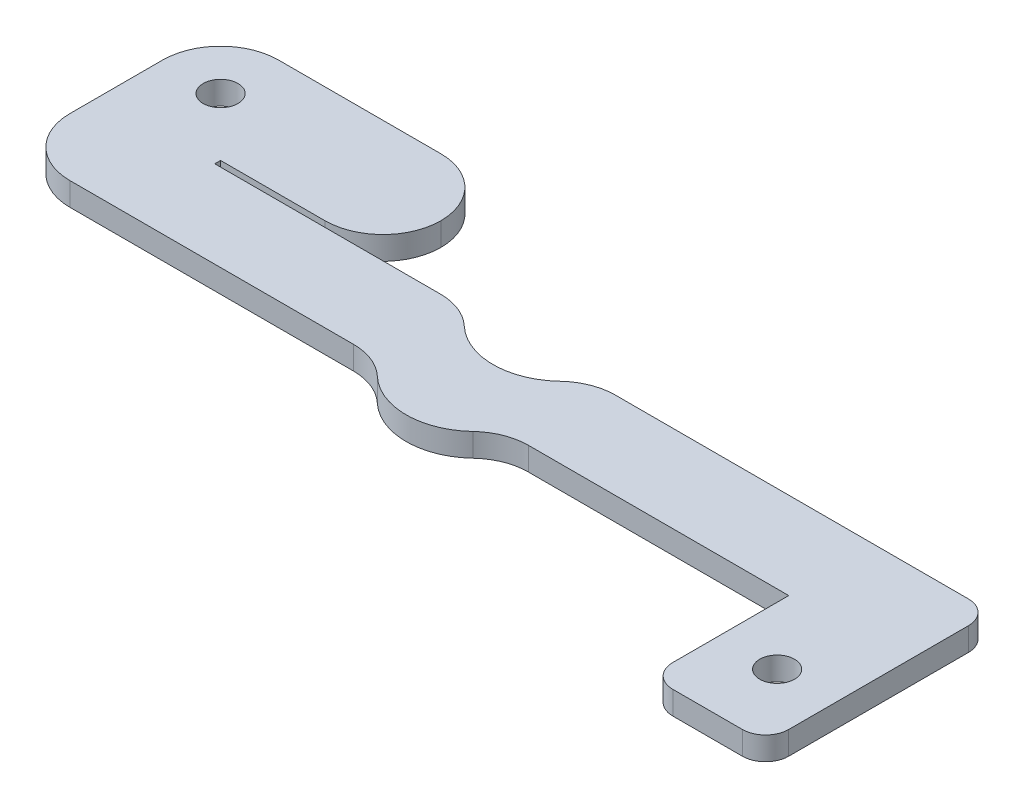
ISO-10303-21;
HEADER;
FILE_DESCRIPTION(('STEP AP214'),'2;1');
FILE_NAME('part.step','',(''),(''),'','','');
FILE_SCHEMA(('AUTOMOTIVE_DESIGN { 1 0 10303 214 1 1 1 1 }'));
ENDSEC;
DATA;
#1=APPLICATION_CONTEXT('core data for automotive mechanical design processes');
#2=APPLICATION_PROTOCOL_DEFINITION('international standard','automotive_design',2000,#1);
#3=PRODUCT_CONTEXT('',#1,'mechanical');
#4=PRODUCT('Part','Part','',(#3));
#5=PRODUCT_RELATED_PRODUCT_CATEGORY('part','',(#4));
#6=PRODUCT_DEFINITION_FORMATION('','',#4);
#7=PRODUCT_DEFINITION_CONTEXT('part definition',#1,'design');
#8=PRODUCT_DEFINITION('design','',#6,#7);
#9=PRODUCT_DEFINITION_SHAPE('','',#8);
#10=(LENGTH_UNIT() NAMED_UNIT(*) SI_UNIT(.MILLI.,.METRE.));
#11=(NAMED_UNIT(*) PLANE_ANGLE_UNIT() SI_UNIT($,.RADIAN.));
#12=(NAMED_UNIT(*) SI_UNIT($,.STERADIAN.) SOLID_ANGLE_UNIT());
#13=UNCERTAINTY_MEASURE_WITH_UNIT(LENGTH_MEASURE(1.E-05),#10,'distance_accuracy_value','');
#14=(GEOMETRIC_REPRESENTATION_CONTEXT(3) GLOBAL_UNCERTAINTY_ASSIGNED_CONTEXT((#13)) GLOBAL_UNIT_ASSIGNED_CONTEXT((#10,
#11,#12)) REPRESENTATION_CONTEXT('',''));
#15=CARTESIAN_POINT('',(0.,0.,0.));
#16=DIRECTION('',(0.,0.,1.));
#17=DIRECTION('',(1.,0.,0.));
#18=AXIS2_PLACEMENT_3D('',#15,#16,#17);
#19=CARTESIAN_POINT('',(-15.,2.,-5.));
#20=DIRECTION('',(-1.,0.,0.));
#21=DIRECTION('',(0.,0.,1.));
#22=AXIS2_PLACEMENT_3D('',#19,#20,#21);
#23=PLANE('',#22);
#24=DIRECTION('',(0.,-1.,0.));
#25=VECTOR('',#24,1.);
#26=CARTESIAN_POINT('',(-15.,0.,5.));
#27=LINE('',#26,#25);
#28=CARTESIAN_POINT('',(-15.,2.,5.));
#29=VERTEX_POINT('',#28);
#30=CARTESIAN_POINT('',(-15.,0.,5.));
#31=VERTEX_POINT('',#30);
#32=EDGE_CURVE('E210',#29,#31,#27,.T.);
#33=ORIENTED_EDGE('',*,*,#32,.F.);
#34=DIRECTION('',(0.,0.,-1.));
#35=VECTOR('',#34,1.);
#36=CARTESIAN_POINT('',(-15.,2.,-5.));
#37=LINE('',#36,#35);
#38=CARTESIAN_POINT('',(-15.,2.,5.5));
#39=VERTEX_POINT('',#38);
#40=EDGE_CURVE('E222',#39,#29,#37,.T.);
#41=ORIENTED_EDGE('',*,*,#40,.F.);
#42=DIRECTION('',(0.,-1.,0.));
#43=VECTOR('',#42,1.);
#44=CARTESIAN_POINT('',(-15.,2.,5.5));
#45=LINE('',#44,#43);
#46=CARTESIAN_POINT('',(-15.,0.,5.5));
#47=VERTEX_POINT('',#46);
#48=EDGE_CURVE('E258',#39,#47,#45,.T.);
#49=ORIENTED_EDGE('',*,*,#48,.T.);
#50=DIRECTION('',(0.,0.,-1.));
#51=VECTOR('',#50,1.);
#52=CARTESIAN_POINT('',(-15.,0.,-5.));
#53=LINE('',#52,#51);
#54=EDGE_CURVE('E224',#47,#31,#53,.T.);
#55=ORIENTED_EDGE('',*,*,#54,.T.);
#56=EDGE_LOOP('',(#33,#41,#49,#55));
#57=FACE_BOUND('',#56,.T.);
#58=ADVANCED_FACE('F47',(#57),#23,.F.);
#59=CARTESIAN_POINT('',(17.1961524227066,2.,13.));
#60=DIRECTION('',(0.,0.,-1.));
#61=DIRECTION('',(-1.,0.,0.));
#62=AXIS2_PLACEMENT_3D('',#59,#60,#61);
#63=PLANE('',#62);
#64=DIRECTION('',(0.,-1.,0.));
#65=VECTOR('',#64,1.);
#66=CARTESIAN_POINT('',(42.,0.,13.));
#67=LINE('',#66,#65);
#68=CARTESIAN_POINT('',(42.,2.,13.));
#69=VERTEX_POINT('',#68);
#70=CARTESIAN_POINT('',(42.,0.,13.));
#71=VERTEX_POINT('',#70);
#72=EDGE_CURVE('E340',#69,#71,#67,.T.);
#73=ORIENTED_EDGE('',*,*,#72,.F.);
#74=DIRECTION('',(1.,0.,0.));
#75=VECTOR('',#74,1.);
#76=CARTESIAN_POINT('',(17.1961524227066,2.,13.));
#77=LINE('',#76,#75);
#78=CARTESIAN_POINT('',(19.5498344352708,2.,13.));
#79=VERTEX_POINT('',#78);
#80=EDGE_CURVE('E250',#79,#69,#77,.T.);
#81=ORIENTED_EDGE('',*,*,#80,.F.);
#82=DIRECTION('',(0.,1.,0.));
#83=VECTOR('',#82,1.);
#84=CARTESIAN_POINT('',(19.5498344352708,0.,13.));
#85=LINE('',#84,#83);
#86=CARTESIAN_POINT('',(19.5498344352708,0.,13.));
#87=VERTEX_POINT('',#86);
#88=EDGE_CURVE('E318',#79,#87,#85,.F.);
#89=ORIENTED_EDGE('',*,*,#88,.T.);
#90=DIRECTION('',(1.,0.,0.));
#91=VECTOR('',#90,1.);
#92=CARTESIAN_POINT('',(17.1961524227066,0.,13.));
#93=LINE('',#92,#91);
#94=EDGE_CURVE('E272',#87,#71,#93,.T.);
#95=ORIENTED_EDGE('',*,*,#94,.T.);
#96=EDGE_LOOP('',(#73,#81,#89,#95));
#97=FACE_BOUND('',#96,.T.);
#98=ADVANCED_FACE('F421',(#97),#63,.F.);
#99=CARTESIAN_POINT('',(-15.,2.,5.5));
#100=DIRECTION('',(0.,0.,1.));
#101=DIRECTION('',(1.,0.,0.));
#102=AXIS2_PLACEMENT_3D('',#99,#100,#101);
#103=PLANE('',#102);
#104=DIRECTION('',(-1.,0.,0.));
#105=VECTOR('',#104,1.);
#106=CARTESIAN_POINT('',(-15.,2.,5.5));
#107=LINE('',#106,#105);
#108=CARTESIAN_POINT('',(50.,2.,5.5));
#109=VERTEX_POINT('',#108);
#110=CARTESIAN_POINT('',(19.5498344352708,2.,5.5));
#111=VERTEX_POINT('',#110);
#112=EDGE_CURVE('E256',#109,#111,#107,.T.);
#113=ORIENTED_EDGE('',*,*,#112,.F.);
#114=DIRECTION('',(0.,-1.,0.));
#115=VECTOR('',#114,1.);
#116=CARTESIAN_POINT('',(50.,2.,5.5));
#117=LINE('',#116,#115);
#118=CARTESIAN_POINT('',(50.,0.,5.5));
#119=VERTEX_POINT('',#118);
#120=EDGE_CURVE('E336',#109,#119,#117,.T.);
#121=ORIENTED_EDGE('',*,*,#120,.T.);
#122=DIRECTION('',(-1.,0.,0.));
#123=VECTOR('',#122,1.);
#124=CARTESIAN_POINT('',(-15.,0.,5.5));
#125=LINE('',#124,#123);
#126=CARTESIAN_POINT('',(19.5498344352708,0.,5.5));
#127=VERTEX_POINT('',#126);
#128=EDGE_CURVE('E232',#119,#127,#125,.T.);
#129=ORIENTED_EDGE('',*,*,#128,.T.);
#130=DIRECTION('',(0.,1.,0.));
#131=VECTOR('',#130,1.);
#132=CARTESIAN_POINT('',(19.5498344352708,2.,5.5));
#133=LINE('',#132,#131);
#134=EDGE_CURVE('E315',#127,#111,#133,.T.);
#135=ORIENTED_EDGE('',*,*,#134,.T.);
#136=EDGE_LOOP('',(#113,#121,#129,#135));
#137=FACE_BOUND('',#136,.T.);
#138=ADVANCED_FACE('F460',(#137),#103,.F.);
#139=CARTESIAN_POINT('',(12.,2.,10.));
#140=DIRECTION('',(0.,1.,0.));
#141=DIRECTION('',(0.,0.,1.));
#142=AXIS2_PLACEMENT_3D('',#139,#140,#141);
#143=PLANE('',#142);
#144=CARTESIAN_POINT('',(47.,2.,19.));
#145=DIRECTION('',(0.,1.,0.));
#146=DIRECTION('',(0.,0.,1.));
#147=AXIS2_PLACEMENT_3D('',#144,#145,#146);
#148=CIRCLE('',#147,1.5);
#149=CARTESIAN_POINT('',(47.,2.,20.5));
#150=VERTEX_POINT('',#149);
#151=EDGE_CURVE('E216',#150,#150,#148,.T.);
#152=ORIENTED_EDGE('',*,*,#151,.F.);
#153=EDGE_LOOP('',(#152));
#154=FACE_BOUND('',#153,.T.);
#155=CARTESIAN_POINT('',(-5.99999999999998,2.,0.));
#156=DIRECTION('',(0.,1.,0.));
#157=DIRECTION('',(0.,0.,1.));
#158=AXIS2_PLACEMENT_3D('',#155,#156,#157);
#159=CIRCLE('',#158,5.);
#160=CARTESIAN_POINT('',(-5.99999999999998,2.,5.));
#161=VERTEX_POINT('',#160);
#162=CARTESIAN_POINT('',(-0.999999999999982,2.,0.));
#163=VERTEX_POINT('',#162);
#164=EDGE_CURVE('E373',#161,#163,#159,.T.);
#165=ORIENTED_EDGE('',*,*,#164,.T.);
#166=CARTESIAN_POINT('',(-5.99999999999998,2.,0.));
#167=DIRECTION('',(0.,1.,0.));
#168=DIRECTION('',(0.,0.,1.));
#169=AXIS2_PLACEMENT_3D('',#166,#167,#168);
#170=CIRCLE('',#169,5.);
#171=CARTESIAN_POINT('',(-5.99999999999998,2.,-5.));
#172=VERTEX_POINT('',#171);
#173=EDGE_CURVE('E69',#163,#172,#170,.T.);
#174=ORIENTED_EDGE('',*,*,#173,.T.);
#175=DIRECTION('',(-1.,0.,0.));
#176=VECTOR('',#175,1.);
#177=CARTESIAN_POINT('',(-15.,2.,-5.));
#178=LINE('',#177,#176);
#179=CARTESIAN_POINT('',(-20.,2.,-5.));
#180=VERTEX_POINT('',#179);
#181=EDGE_CURVE('E231',#172,#180,#178,.T.);
#182=ORIENTED_EDGE('',*,*,#181,.T.);
#183=CARTESIAN_POINT('',(-20.,2.,0.));
#184=DIRECTION('',(0.,1.,0.));
#185=DIRECTION('',(0.,0.,1.));
#186=AXIS2_PLACEMENT_3D('',#183,#184,#185);
#187=CIRCLE('',#186,5.);
#188=CARTESIAN_POINT('',(-25.,2.,0.));
#189=VERTEX_POINT('',#188);
#190=EDGE_CURVE('E288',#180,#189,#187,.T.);
#191=ORIENTED_EDGE('',*,*,#190,.T.);
#192=DIRECTION('',(0.,0.,1.));
#193=VECTOR('',#192,1.);
#194=CARTESIAN_POINT('',(-25.,2.,-5.));
#195=LINE('',#194,#193);
#196=CARTESIAN_POINT('',(-25.,2.,8.));
#197=VERTEX_POINT('',#196);
#198=EDGE_CURVE('E234',#189,#197,#195,.T.);
#199=ORIENTED_EDGE('',*,*,#198,.T.);
#200=CARTESIAN_POINT('',(-20.,2.,8.));
#201=DIRECTION('',(0.,1.,0.));
#202=DIRECTION('',(0.,0.,1.));
#203=AXIS2_PLACEMENT_3D('',#200,#201,#202);
#204=CIRCLE('',#203,5.);
#205=CARTESIAN_POINT('',(-20.,2.,13.));
#206=VERTEX_POINT('',#205);
#207=EDGE_CURVE('E297',#197,#206,#204,.T.);
#208=ORIENTED_EDGE('',*,*,#207,.T.);
#209=DIRECTION('',(1.,0.,0.));
#210=VECTOR('',#209,1.);
#211=CARTESIAN_POINT('',(-25.,2.,13.));
#212=LINE('',#211,#210);
#213=CARTESIAN_POINT('',(4.45016556472926,2.,13.));
#214=VERTEX_POINT('',#213);
#215=EDGE_CURVE('E244',#206,#214,#212,.T.);
#216=ORIENTED_EDGE('',*,*,#215,.T.);
#217=CARTESIAN_POINT('',(4.45016556472926,2.,18.));
#218=DIRECTION('',(0.,1.,0.));
#219=DIRECTION('',(0.,0.,1.));
#220=AXIS2_PLACEMENT_3D('',#217,#218,#219);
#221=CIRCLE('',#220,5.);
#222=CARTESIAN_POINT('',(7.88190848985233,2.,14.3636363636364));
#223=VERTEX_POINT('',#222);
#224=EDGE_CURVE('E334',#214,#223,#221,.F.);
#225=ORIENTED_EDGE('',*,*,#224,.T.);
#226=CARTESIAN_POINT('',(12.,2.,10.));
#227=DIRECTION('',(0.,1.,0.));
#228=DIRECTION('',(0.,0.,1.));
#229=AXIS2_PLACEMENT_3D('',#226,#227,#228);
#230=CIRCLE('',#229,6.);
#231=CARTESIAN_POINT('',(16.1180915101477,2.,14.3636363636364));
#232=VERTEX_POINT('',#231);
#233=EDGE_CURVE('E247',#223,#232,#230,.T.);
#234=ORIENTED_EDGE('',*,*,#233,.T.);
#235=CARTESIAN_POINT('',(19.5498344352708,2.,18.));
#236=DIRECTION('',(0.,1.,0.));
#237=DIRECTION('',(0.,0.,1.));
#238=AXIS2_PLACEMENT_3D('',#235,#236,#237);
#239=CIRCLE('',#238,5.);
#240=EDGE_CURVE('E330',#232,#79,#239,.F.);
#241=ORIENTED_EDGE('',*,*,#240,.T.);
#242=ORIENTED_EDGE('',*,*,#80,.T.);
#243=DIRECTION('',(0.,0.,-1.));
#244=VECTOR('',#243,1.);
#245=CARTESIAN_POINT('',(42.,2.,25.));
#246=LINE('',#245,#244);
#247=CARTESIAN_POINT('',(42.,2.,23.));
#248=VERTEX_POINT('',#247);
#249=EDGE_CURVE('E435',#248,#69,#246,.T.);
#250=ORIENTED_EDGE('',*,*,#249,.F.);
#251=CARTESIAN_POINT('',(44.,2.,23.));
#252=DIRECTION('',(0.,1.,0.));
#253=DIRECTION('',(0.,0.,1.));
#254=AXIS2_PLACEMENT_3D('',#251,#252,#253);
#255=CIRCLE('',#254,2.);
#256=CARTESIAN_POINT('',(44.,2.,25.));
#257=VERTEX_POINT('',#256);
#258=EDGE_CURVE('E353',#248,#257,#255,.T.);
#259=ORIENTED_EDGE('',*,*,#258,.T.);
#260=DIRECTION('',(-1.,0.,0.));
#261=VECTOR('',#260,1.);
#262=CARTESIAN_POINT('',(52.,2.,25.));
#263=LINE('',#262,#261);
#264=CARTESIAN_POINT('',(50.,2.,25.));
#265=VERTEX_POINT('',#264);
#266=EDGE_CURVE('E426',#265,#257,#263,.T.);
#267=ORIENTED_EDGE('',*,*,#266,.F.);
#268=CARTESIAN_POINT('',(50.,2.,23.));
#269=DIRECTION('',(0.,1.,0.));
#270=DIRECTION('',(0.,0.,1.));
#271=AXIS2_PLACEMENT_3D('',#268,#269,#270);
#272=CIRCLE('',#271,2.);
#273=CARTESIAN_POINT('',(52.,2.,23.));
#274=VERTEX_POINT('',#273);
#275=EDGE_CURVE('E355',#265,#274,#272,.T.);
#276=ORIENTED_EDGE('',*,*,#275,.T.);
#277=DIRECTION('',(0.,0.,-1.));
#278=VECTOR('',#277,1.);
#279=CARTESIAN_POINT('',(52.,2.,13.));
#280=LINE('',#279,#278);
#281=CARTESIAN_POINT('',(52.,2.,7.5));
#282=VERTEX_POINT('',#281);
#283=EDGE_CURVE('E253',#274,#282,#280,.T.);
#284=ORIENTED_EDGE('',*,*,#283,.T.);
#285=CARTESIAN_POINT('',(50.,2.,7.5));
#286=DIRECTION('',(0.,1.,0.));
#287=DIRECTION('',(0.,0.,1.));
#288=AXIS2_PLACEMENT_3D('',#285,#286,#287);
#289=CIRCLE('',#288,2.);
#290=EDGE_CURVE('E357',#282,#109,#289,.T.);
#291=ORIENTED_EDGE('',*,*,#290,.T.);
#292=ORIENTED_EDGE('',*,*,#112,.T.);
#293=CARTESIAN_POINT('',(19.5498344352708,2.,10.5));
#294=DIRECTION('',(0.,1.,0.));
#295=DIRECTION('',(0.,0.,1.));
#296=AXIS2_PLACEMENT_3D('',#293,#294,#295);
#297=CIRCLE('',#296,5.);
#298=CARTESIAN_POINT('',(16.1180915101477,2.,6.86363636363637));
#299=VERTEX_POINT('',#298);
#300=EDGE_CURVE('E311',#111,#299,#297,.T.);
#301=ORIENTED_EDGE('',*,*,#300,.T.);
#302=CARTESIAN_POINT('',(12.,2.,2.5));
#303=DIRECTION('',(0.,1.,0.));
#304=DIRECTION('',(0.,0.,1.));
#305=AXIS2_PLACEMENT_3D('',#302,#303,#304);
#306=CIRCLE('',#305,6.);
#307=CARTESIAN_POINT('',(7.88190848985233,2.,6.86363636363636));
#308=VERTEX_POINT('',#307);
#309=EDGE_CURVE('E437',#308,#299,#306,.T.);
#310=ORIENTED_EDGE('',*,*,#309,.F.);
#311=CARTESIAN_POINT('',(4.45016556472926,2.,10.5));
#312=DIRECTION('',(0.,1.,0.));
#313=DIRECTION('',(0.,0.,1.));
#314=AXIS2_PLACEMENT_3D('',#311,#312,#313);
#315=CIRCLE('',#314,5.);
#316=CARTESIAN_POINT('',(4.45016556472926,2.,5.5));
#317=VERTEX_POINT('',#316);
#318=EDGE_CURVE('E313',#308,#317,#315,.T.);
#319=ORIENTED_EDGE('',*,*,#318,.T.);
#320=EDGE_CURVE('E229',#317,#39,#107,.T.);
#321=ORIENTED_EDGE('',*,*,#320,.T.);
#322=ORIENTED_EDGE('',*,*,#40,.T.);
#323=DIRECTION('',(-1.,0.,0.));
#324=VECTOR('',#323,1.);
#325=CARTESIAN_POINT('',(-0.99999999999998,2.,4.99999999999999));
#326=LINE('',#325,#324);
#327=EDGE_CURVE('E206',#161,#29,#326,.T.);
#328=ORIENTED_EDGE('',*,*,#327,.F.);
#329=EDGE_LOOP('',(#165,#174,#182,#191,#199,#208,#216,#225,#234,#241,#242,#250,#259,#267,#276,
#284,#291,#292,#301,#310,#319,#321,#322,#328));
#330=FACE_BOUND('',#329,.T.);
#331=CARTESIAN_POINT('',(-20.,2.,0.));
#332=DIRECTION('',(0.,1.,0.));
#333=DIRECTION('',(0.,0.,1.));
#334=AXIS2_PLACEMENT_3D('',#331,#332,#333);
#335=CIRCLE('',#334,1.5);
#336=CARTESIAN_POINT('',(-20.,2.,1.5));
#337=VERTEX_POINT('',#336);
#338=EDGE_CURVE('E261',#337,#337,#335,.T.);
#339=ORIENTED_EDGE('',*,*,#338,.F.);
#340=EDGE_LOOP('',(#339));
#341=FACE_BOUND('',#340,.T.);
#342=ADVANCED_FACE('F226',(#154,#330,#341),#143,.T.);
#343=CARTESIAN_POINT('',(12.,0.,10.));
#344=DIRECTION('',(0.,1.,0.));
#345=DIRECTION('',(0.,0.,1.));
#346=AXIS2_PLACEMENT_3D('',#343,#344,#345);
#347=PLANE('',#346);
#348=CARTESIAN_POINT('',(47.,0.,19.));
#349=DIRECTION('',(0.,1.,0.));
#350=DIRECTION('',(0.,0.,1.));
#351=AXIS2_PLACEMENT_3D('',#348,#349,#350);
#352=CIRCLE('',#351,1.5);
#353=CARTESIAN_POINT('',(47.,0.,20.5));
#354=VERTEX_POINT('',#353);
#355=EDGE_CURVE('E337',#354,#354,#352,.T.);
#356=ORIENTED_EDGE('',*,*,#355,.T.);
#357=EDGE_LOOP('',(#356));
#358=FACE_BOUND('',#357,.T.);
#359=DIRECTION('',(-1.,0.,0.));
#360=VECTOR('',#359,1.);
#361=CARTESIAN_POINT('',(-15.,0.,-5.));
#362=LINE('',#361,#360);
#363=CARTESIAN_POINT('',(-5.99999999999998,0.,-5.));
#364=VERTEX_POINT('',#363);
#365=CARTESIAN_POINT('',(-20.,0.,-5.));
#366=VERTEX_POINT('',#365);
#367=EDGE_CURVE('E260',#364,#366,#362,.T.);
#368=ORIENTED_EDGE('',*,*,#367,.F.);
#369=CARTESIAN_POINT('',(-5.99999999999998,0.,0.));
#370=DIRECTION('',(0.,1.,0.));
#371=DIRECTION('',(0.,0.,1.));
#372=AXIS2_PLACEMENT_3D('',#369,#370,#371);
#373=CIRCLE('',#372,5.);
#374=CARTESIAN_POINT('',(-0.999999999999982,0.,0.));
#375=VERTEX_POINT('',#374);
#376=EDGE_CURVE('E13',#364,#375,#373,.F.);
#377=ORIENTED_EDGE('',*,*,#376,.T.);
#378=CARTESIAN_POINT('',(-5.99999999999998,0.,0.));
#379=DIRECTION('',(0.,1.,0.));
#380=DIRECTION('',(0.,0.,1.));
#381=AXIS2_PLACEMENT_3D('',#378,#379,#380);
#382=CIRCLE('',#381,5.);
#383=CARTESIAN_POINT('',(-5.99999999999998,0.,5.));
#384=VERTEX_POINT('',#383);
#385=EDGE_CURVE('E370',#375,#384,#382,.F.);
#386=ORIENTED_EDGE('',*,*,#385,.T.);
#387=DIRECTION('',(-1.,0.,0.));
#388=VECTOR('',#387,1.);
#389=CARTESIAN_POINT('',(-0.99999999999998,0.,4.99999999999999));
#390=LINE('',#389,#388);
#391=EDGE_CURVE('E217',#384,#31,#390,.T.);
#392=ORIENTED_EDGE('',*,*,#391,.T.);
#393=ORIENTED_EDGE('',*,*,#54,.F.);
#394=CARTESIAN_POINT('',(4.45016556472926,0.,5.5));
#395=VERTEX_POINT('',#394);
#396=EDGE_CURVE('E236',#395,#47,#125,.T.);
#397=ORIENTED_EDGE('',*,*,#396,.F.);
#398=CARTESIAN_POINT('',(4.45016556472926,0.,10.5));
#399=DIRECTION('',(0.,1.,0.));
#400=DIRECTION('',(0.,0.,1.));
#401=AXIS2_PLACEMENT_3D('',#398,#399,#400);
#402=CIRCLE('',#401,5.);
#403=CARTESIAN_POINT('',(7.88190848985233,0.,6.86363636363636));
#404=VERTEX_POINT('',#403);
#405=EDGE_CURVE('E305',#395,#404,#402,.F.);
#406=ORIENTED_EDGE('',*,*,#405,.T.);
#407=CARTESIAN_POINT('',(12.,0.,2.5));
#408=DIRECTION('',(0.,1.,0.));
#409=DIRECTION('',(0.,0.,1.));
#410=AXIS2_PLACEMENT_3D('',#407,#408,#409);
#411=CIRCLE('',#410,6.);
#412=CARTESIAN_POINT('',(16.1180915101477,0.,6.86363636363637));
#413=VERTEX_POINT('',#412);
#414=EDGE_CURVE('E440',#404,#413,#411,.T.);
#415=ORIENTED_EDGE('',*,*,#414,.T.);
#416=CARTESIAN_POINT('',(19.5498344352708,0.,10.5));
#417=DIRECTION('',(0.,1.,0.));
#418=DIRECTION('',(0.,0.,1.));
#419=AXIS2_PLACEMENT_3D('',#416,#417,#418);
#420=CIRCLE('',#419,5.);
#421=EDGE_CURVE('E302',#413,#127,#420,.F.);
#422=ORIENTED_EDGE('',*,*,#421,.T.);
#423=ORIENTED_EDGE('',*,*,#128,.F.);
#424=CARTESIAN_POINT('',(50.,0.,7.5));
#425=DIRECTION('',(0.,1.,0.));
#426=DIRECTION('',(0.,0.,1.));
#427=AXIS2_PLACEMENT_3D('',#424,#425,#426);
#428=CIRCLE('',#427,2.);
#429=CARTESIAN_POINT('',(52.,0.,7.5));
#430=VERTEX_POINT('',#429);
#431=EDGE_CURVE('E347',#119,#430,#428,.F.);
#432=ORIENTED_EDGE('',*,*,#431,.T.);
#433=DIRECTION('',(0.,0.,-1.));
#434=VECTOR('',#433,1.);
#435=CARTESIAN_POINT('',(52.,0.,13.));
#436=LINE('',#435,#434);
#437=CARTESIAN_POINT('',(52.,0.,23.));
#438=VERTEX_POINT('',#437);
#439=EDGE_CURVE('E275',#438,#430,#436,.T.);
#440=ORIENTED_EDGE('',*,*,#439,.F.);
#441=CARTESIAN_POINT('',(50.,0.,23.));
#442=DIRECTION('',(0.,1.,0.));
#443=DIRECTION('',(0.,0.,1.));
#444=AXIS2_PLACEMENT_3D('',#441,#442,#443);
#445=CIRCLE('',#444,2.);
#446=CARTESIAN_POINT('',(50.,0.,25.));
#447=VERTEX_POINT('',#446);
#448=EDGE_CURVE('E345',#438,#447,#445,.F.);
#449=ORIENTED_EDGE('',*,*,#448,.T.);
#450=DIRECTION('',(1.,0.,0.));
#451=VECTOR('',#450,1.);
#452=CARTESIAN_POINT('',(52.,0.,25.));
#453=LINE('',#452,#451);
#454=CARTESIAN_POINT('',(44.,0.,25.));
#455=VERTEX_POINT('',#454);
#456=EDGE_CURVE('E429',#455,#447,#453,.T.);
#457=ORIENTED_EDGE('',*,*,#456,.F.);
#458=CARTESIAN_POINT('',(44.,0.,23.));
#459=DIRECTION('',(0.,1.,0.));
#460=DIRECTION('',(0.,0.,1.));
#461=AXIS2_PLACEMENT_3D('',#458,#459,#460);
#462=CIRCLE('',#461,2.);
#463=CARTESIAN_POINT('',(42.,0.,23.));
#464=VERTEX_POINT('',#463);
#465=EDGE_CURVE('E343',#455,#464,#462,.F.);
#466=ORIENTED_EDGE('',*,*,#465,.T.);
#467=DIRECTION('',(0.,0.,-1.));
#468=VECTOR('',#467,1.);
#469=CARTESIAN_POINT('',(42.,0.,25.));
#470=LINE('',#469,#468);
#471=EDGE_CURVE('E433',#464,#71,#470,.T.);
#472=ORIENTED_EDGE('',*,*,#471,.T.);
#473=ORIENTED_EDGE('',*,*,#94,.F.);
#474=CARTESIAN_POINT('',(19.5498344352708,0.,18.));
#475=DIRECTION('',(0.,1.,0.));
#476=DIRECTION('',(0.,0.,1.));
#477=AXIS2_PLACEMENT_3D('',#474,#475,#476);
#478=CIRCLE('',#477,5.);
#479=CARTESIAN_POINT('',(16.1180915101477,0.,14.3636363636364));
#480=VERTEX_POINT('',#479);
#481=EDGE_CURVE('E328',#87,#480,#478,.T.);
#482=ORIENTED_EDGE('',*,*,#481,.T.);
#483=CARTESIAN_POINT('',(12.,0.,10.));
#484=DIRECTION('',(0.,1.,0.));
#485=DIRECTION('',(0.,0.,1.));
#486=AXIS2_PLACEMENT_3D('',#483,#484,#485);
#487=CIRCLE('',#486,6.);
#488=CARTESIAN_POINT('',(7.88190848985233,0.,14.3636363636364));
#489=VERTEX_POINT('',#488);
#490=EDGE_CURVE('E269',#489,#480,#487,.T.);
#491=ORIENTED_EDGE('',*,*,#490,.F.);
#492=CARTESIAN_POINT('',(4.45016556472926,0.,18.));
#493=DIRECTION('',(0.,1.,0.));
#494=DIRECTION('',(0.,0.,1.));
#495=AXIS2_PLACEMENT_3D('',#492,#493,#494);
#496=CIRCLE('',#495,5.);
#497=CARTESIAN_POINT('',(4.45016556472926,0.,13.));
#498=VERTEX_POINT('',#497);
#499=EDGE_CURVE('E332',#489,#498,#496,.T.);
#500=ORIENTED_EDGE('',*,*,#499,.T.);
#501=DIRECTION('',(1.,0.,0.));
#502=VECTOR('',#501,1.);
#503=CARTESIAN_POINT('',(-25.,0.,13.));
#504=LINE('',#503,#502);
#505=CARTESIAN_POINT('',(-20.,0.,13.));
#506=VERTEX_POINT('',#505);
#507=EDGE_CURVE('E266',#506,#498,#504,.T.);
#508=ORIENTED_EDGE('',*,*,#507,.F.);
#509=CARTESIAN_POINT('',(-20.,0.,8.));
#510=DIRECTION('',(0.,1.,0.));
#511=DIRECTION('',(0.,0.,1.));
#512=AXIS2_PLACEMENT_3D('',#509,#510,#511);
#513=CIRCLE('',#512,5.);
#514=CARTESIAN_POINT('',(-25.,0.,8.));
#515=VERTEX_POINT('',#514);
#516=EDGE_CURVE('E293',#506,#515,#513,.F.);
#517=ORIENTED_EDGE('',*,*,#516,.T.);
#518=DIRECTION('',(0.,0.,1.));
#519=VECTOR('',#518,1.);
#520=CARTESIAN_POINT('',(-25.,0.,-5.));
#521=LINE('',#520,#519);
#522=CARTESIAN_POINT('',(-25.,0.,0.));
#523=VERTEX_POINT('',#522);
#524=EDGE_CURVE('E263',#523,#515,#521,.T.);
#525=ORIENTED_EDGE('',*,*,#524,.F.);
#526=CARTESIAN_POINT('',(-20.,0.,0.));
#527=DIRECTION('',(0.,1.,0.));
#528=DIRECTION('',(0.,0.,1.));
#529=AXIS2_PLACEMENT_3D('',#526,#527,#528);
#530=CIRCLE('',#529,5.);
#531=EDGE_CURVE('E282',#523,#366,#530,.F.);
#532=ORIENTED_EDGE('',*,*,#531,.T.);
#533=EDGE_LOOP('',(#368,#377,#386,#392,#393,#397,#406,#415,#422,#423,#432,#440,#449,#457,#466,
#472,#473,#482,#491,#500,#508,#517,#525,#532));
#534=FACE_BOUND('',#533,.T.);
#535=CARTESIAN_POINT('',(-20.,0.,0.));
#536=DIRECTION('',(0.,1.,0.));
#537=DIRECTION('',(0.,0.,1.));
#538=AXIS2_PLACEMENT_3D('',#535,#536,#537);
#539=CIRCLE('',#538,1.5);
#540=CARTESIAN_POINT('',(-20.,0.,1.5));
#541=VERTEX_POINT('',#540);
#542=EDGE_CURVE('E239',#541,#541,#539,.T.);
#543=ORIENTED_EDGE('',*,*,#542,.T.);
#544=EDGE_LOOP('',(#543));
#545=FACE_BOUND('',#544,.T.);
#546=ADVANCED_FACE('F382',(#358,#534,#545),#347,.F.);
#547=CARTESIAN_POINT('',(-15.,2.,-5.));
#548=DIRECTION('',(0.,0.,1.));
#549=DIRECTION('',(1.,0.,0.));
#550=AXIS2_PLACEMENT_3D('',#547,#548,#549);
#551=PLANE('',#550);
#552=ORIENTED_EDGE('',*,*,#181,.F.);
#553=DIRECTION('',(0.,1.,0.));
#554=VECTOR('',#553,1.);
#555=CARTESIAN_POINT('',(-5.99999999999998,0.,-5.));
#556=LINE('',#555,#554);
#557=EDGE_CURVE('E55',#172,#364,#556,.F.);
#558=ORIENTED_EDGE('',*,*,#557,.T.);
#559=ORIENTED_EDGE('',*,*,#367,.T.);
#560=DIRECTION('',(0.,-1.,0.));
#561=VECTOR('',#560,1.);
#562=CARTESIAN_POINT('',(-20.,2.,-5.));
#563=LINE('',#562,#561);
#564=EDGE_CURVE('E285',#366,#180,#563,.F.);
#565=ORIENTED_EDGE('',*,*,#564,.T.);
#566=EDGE_LOOP('',(#552,#558,#559,#565));
#567=FACE_BOUND('',#566,.T.);
#568=ADVANCED_FACE('F386',(#567),#551,.F.);
#569=CARTESIAN_POINT('',(-25.,2.,-5.));
#570=DIRECTION('',(1.,0.,0.));
#571=DIRECTION('',(0.,0.,-1.));
#572=AXIS2_PLACEMENT_3D('',#569,#570,#571);
#573=PLANE('',#572);
#574=ORIENTED_EDGE('',*,*,#524,.T.);
#575=DIRECTION('',(0.,-1.,0.));
#576=VECTOR('',#575,1.);
#577=CARTESIAN_POINT('',(-25.,2.,8.));
#578=LINE('',#577,#576);
#579=EDGE_CURVE('E295',#515,#197,#578,.F.);
#580=ORIENTED_EDGE('',*,*,#579,.T.);
#581=ORIENTED_EDGE('',*,*,#198,.F.);
#582=DIRECTION('',(0.,-1.,0.));
#583=VECTOR('',#582,1.);
#584=CARTESIAN_POINT('',(-25.,2.,0.));
#585=LINE('',#584,#583);
#586=EDGE_CURVE('E279',#189,#523,#585,.T.);
#587=ORIENTED_EDGE('',*,*,#586,.T.);
#588=EDGE_LOOP('',(#574,#580,#581,#587));
#589=FACE_BOUND('',#588,.T.);
#590=ADVANCED_FACE('F394',(#589),#573,.F.);
#591=CARTESIAN_POINT('',(-25.,2.,13.));
#592=DIRECTION('',(0.,0.,-1.));
#593=DIRECTION('',(-1.,0.,0.));
#594=AXIS2_PLACEMENT_3D('',#591,#592,#593);
#595=PLANE('',#594);
#596=ORIENTED_EDGE('',*,*,#507,.T.);
#597=DIRECTION('',(0.,1.,0.));
#598=VECTOR('',#597,1.);
#599=CARTESIAN_POINT('',(4.45016556472926,2.,13.));
#600=LINE('',#599,#598);
#601=EDGE_CURVE('E326',#498,#214,#600,.T.);
#602=ORIENTED_EDGE('',*,*,#601,.T.);
#603=ORIENTED_EDGE('',*,*,#215,.F.);
#604=DIRECTION('',(0.,-1.,0.));
#605=VECTOR('',#604,1.);
#606=CARTESIAN_POINT('',(-20.,2.,13.));
#607=LINE('',#606,#605);
#608=EDGE_CURVE('E290',#206,#506,#607,.T.);
#609=ORIENTED_EDGE('',*,*,#608,.T.);
#610=EDGE_LOOP('',(#596,#602,#603,#609));
#611=FACE_BOUND('',#610,.T.);
#612=ADVANCED_FACE('F402',(#611),#595,.F.);
#613=CARTESIAN_POINT('',(12.,2.,10.));
#614=DIRECTION('',(0.,-1.,0.));
#615=DIRECTION('',(0.,0.,-1.));
#616=AXIS2_PLACEMENT_3D('',#613,#614,#615);
#617=CYLINDRICAL_SURFACE('',#616,6.);
#618=ORIENTED_EDGE('',*,*,#490,.T.);
#619=DIRECTION('',(0.,-1.,0.));
#620=VECTOR('',#619,1.);
#621=CARTESIAN_POINT('',(16.1180915101477,2.,14.3636363636364));
#622=LINE('',#621,#620);
#623=EDGE_CURVE('E324',#480,#232,#622,.F.);
#624=ORIENTED_EDGE('',*,*,#623,.T.);
#625=ORIENTED_EDGE('',*,*,#233,.F.);
#626=DIRECTION('',(0.,-1.,0.));
#627=VECTOR('',#626,1.);
#628=CARTESIAN_POINT('',(7.88190848985233,2.,14.3636363636364));
#629=LINE('',#628,#627);
#630=EDGE_CURVE('E321',#223,#489,#629,.T.);
#631=ORIENTED_EDGE('',*,*,#630,.T.);
#632=EDGE_LOOP('',(#618,#624,#625,#631));
#633=FACE_BOUND('',#632,.T.);
#634=ADVANCED_FACE('F411',(#633),#617,.T.);
#635=CARTESIAN_POINT('',(52.,2.,13.));
#636=DIRECTION('',(-1.,0.,0.));
#637=DIRECTION('',(0.,0.,1.));
#638=AXIS2_PLACEMENT_3D('',#635,#636,#637);
#639=PLANE('',#638);
#640=ORIENTED_EDGE('',*,*,#439,.T.);
#641=DIRECTION('',(0.,-1.,0.));
#642=VECTOR('',#641,1.);
#643=CARTESIAN_POINT('',(52.,2.,7.5));
#644=LINE('',#643,#642);
#645=EDGE_CURVE('E351',#430,#282,#644,.F.);
#646=ORIENTED_EDGE('',*,*,#645,.T.);
#647=ORIENTED_EDGE('',*,*,#283,.F.);
#648=DIRECTION('',(0.,1.,0.));
#649=VECTOR('',#648,1.);
#650=CARTESIAN_POINT('',(52.,0.,23.));
#651=LINE('',#650,#649);
#652=EDGE_CURVE('E349',#274,#438,#651,.F.);
#653=ORIENTED_EDGE('',*,*,#652,.T.);
#654=EDGE_LOOP('',(#640,#646,#647,#653));
#655=FACE_BOUND('',#654,.T.);
#656=ADVANCED_FACE('F457',(#655),#639,.F.);
#657=ORIENTED_EDGE('',*,*,#320,.F.);
#658=DIRECTION('',(0.,1.,0.));
#659=VECTOR('',#658,1.);
#660=CARTESIAN_POINT('',(4.45016556472926,2.,5.5));
#661=LINE('',#660,#659);
#662=EDGE_CURVE('E299',#317,#395,#661,.F.);
#663=ORIENTED_EDGE('',*,*,#662,.T.);
#664=ORIENTED_EDGE('',*,*,#396,.T.);
#665=ORIENTED_EDGE('',*,*,#48,.F.);
#666=EDGE_LOOP('',(#657,#663,#664,#665));
#667=FACE_BOUND('',#666,.T.);
#668=ADVANCED_FACE('F450',(#667),#103,.F.);
#669=CARTESIAN_POINT('',(-20.,2.,0.));
#670=DIRECTION('',(0.,-1.,0.));
#671=DIRECTION('',(0.,0.,-1.));
#672=AXIS2_PLACEMENT_3D('',#669,#670,#671);
#673=CYLINDRICAL_SURFACE('',#672,1.5);
#674=ORIENTED_EDGE('',*,*,#338,.T.);
#675=EDGE_LOOP('',(#674));
#676=FACE_BOUND('',#675,.T.);
#677=ORIENTED_EDGE('',*,*,#542,.F.);
#678=EDGE_LOOP('',(#677));
#679=FACE_BOUND('',#678,.T.);
#680=ADVANCED_FACE('F448',(#676,#679),#673,.F.);
#681=CARTESIAN_POINT('',(-20.,2.,0.));
#682=DIRECTION('',(0.,-1.,0.));
#683=DIRECTION('',(0.,0.,-1.));
#684=AXIS2_PLACEMENT_3D('',#681,#682,#683);
#685=CYLINDRICAL_SURFACE('',#684,5.);
#686=ORIENTED_EDGE('',*,*,#190,.F.);
#687=ORIENTED_EDGE('',*,*,#564,.F.);
#688=ORIENTED_EDGE('',*,*,#531,.F.);
#689=ORIENTED_EDGE('',*,*,#586,.F.);
#690=EDGE_LOOP('',(#686,#687,#688,#689));
#691=FACE_BOUND('',#690,.T.);
#692=ADVANCED_FACE('F390',(#691),#685,.T.);
#693=CARTESIAN_POINT('',(-20.,2.,8.));
#694=DIRECTION('',(0.,-1.,0.));
#695=DIRECTION('',(0.,0.,-1.));
#696=AXIS2_PLACEMENT_3D('',#693,#694,#695);
#697=CYLINDRICAL_SURFACE('',#696,5.);
#698=ORIENTED_EDGE('',*,*,#207,.F.);
#699=ORIENTED_EDGE('',*,*,#579,.F.);
#700=ORIENTED_EDGE('',*,*,#516,.F.);
#701=ORIENTED_EDGE('',*,*,#608,.F.);
#702=EDGE_LOOP('',(#698,#699,#700,#701));
#703=FACE_BOUND('',#702,.T.);
#704=ADVANCED_FACE('F397',(#703),#697,.T.);
#705=CARTESIAN_POINT('',(12.,-8.,2.5));
#706=DIRECTION('',(0.,1.,0.));
#707=DIRECTION('',(0.,0.,1.));
#708=AXIS2_PLACEMENT_3D('',#705,#706,#707);
#709=CYLINDRICAL_SURFACE('',#708,6.);
#710=ORIENTED_EDGE('',*,*,#414,.F.);
#711=DIRECTION('',(0.,1.,0.));
#712=VECTOR('',#711,1.);
#713=CARTESIAN_POINT('',(7.88190848985233,-8.,6.86363636363636));
#714=LINE('',#713,#712);
#715=EDGE_CURVE('E309',#404,#308,#714,.T.);
#716=ORIENTED_EDGE('',*,*,#715,.T.);
#717=ORIENTED_EDGE('',*,*,#309,.T.);
#718=DIRECTION('',(0.,1.,0.));
#719=VECTOR('',#718,1.);
#720=CARTESIAN_POINT('',(16.1180915101477,-8.,6.86363636363636));
#721=LINE('',#720,#719);
#722=EDGE_CURVE('E307',#299,#413,#721,.F.);
#723=ORIENTED_EDGE('',*,*,#722,.T.);
#724=EDGE_LOOP('',(#710,#716,#717,#723));
#725=FACE_BOUND('',#724,.T.);
#726=ADVANCED_FACE('F474',(#725),#709,.F.);
#727=CARTESIAN_POINT('',(4.45016556472926,-8.,10.5));
#728=DIRECTION('',(0.,1.,0.));
#729=DIRECTION('',(0.,0.,1.));
#730=AXIS2_PLACEMENT_3D('',#727,#728,#729);
#731=CYLINDRICAL_SURFACE('',#730,5.);
#732=ORIENTED_EDGE('',*,*,#318,.F.);
#733=ORIENTED_EDGE('',*,*,#715,.F.);
#734=ORIENTED_EDGE('',*,*,#405,.F.);
#735=ORIENTED_EDGE('',*,*,#662,.F.);
#736=EDGE_LOOP('',(#732,#733,#734,#735));
#737=FACE_BOUND('',#736,.T.);
#738=ADVANCED_FACE('F475',(#737),#731,.T.);
#739=CARTESIAN_POINT('',(19.5498344352708,-8.,10.5));
#740=DIRECTION('',(0.,1.,0.));
#741=DIRECTION('',(0.,0.,1.));
#742=AXIS2_PLACEMENT_3D('',#739,#740,#741);
#743=CYLINDRICAL_SURFACE('',#742,5.);
#744=ORIENTED_EDGE('',*,*,#421,.F.);
#745=ORIENTED_EDGE('',*,*,#722,.F.);
#746=ORIENTED_EDGE('',*,*,#300,.F.);
#747=ORIENTED_EDGE('',*,*,#134,.F.);
#748=EDGE_LOOP('',(#744,#745,#746,#747));
#749=FACE_BOUND('',#748,.T.);
#750=ADVANCED_FACE('F478',(#749),#743,.T.);
#751=CARTESIAN_POINT('',(19.5498344352708,2.,18.));
#752=DIRECTION('',(0.,-1.,0.));
#753=DIRECTION('',(0.,0.,-1.));
#754=AXIS2_PLACEMENT_3D('',#751,#752,#753);
#755=CYLINDRICAL_SURFACE('',#754,5.);
#756=ORIENTED_EDGE('',*,*,#240,.F.);
#757=ORIENTED_EDGE('',*,*,#623,.F.);
#758=ORIENTED_EDGE('',*,*,#481,.F.);
#759=ORIENTED_EDGE('',*,*,#88,.F.);
#760=EDGE_LOOP('',(#756,#757,#758,#759));
#761=FACE_BOUND('',#760,.T.);
#762=ADVANCED_FACE('F415',(#761),#755,.F.);
#763=CARTESIAN_POINT('',(4.45016556472926,2.,18.));
#764=DIRECTION('',(0.,-1.,0.));
#765=DIRECTION('',(0.,0.,-1.));
#766=AXIS2_PLACEMENT_3D('',#763,#764,#765);
#767=CYLINDRICAL_SURFACE('',#766,5.);
#768=ORIENTED_EDGE('',*,*,#224,.F.);
#769=ORIENTED_EDGE('',*,*,#601,.F.);
#770=ORIENTED_EDGE('',*,*,#499,.F.);
#771=ORIENTED_EDGE('',*,*,#630,.F.);
#772=EDGE_LOOP('',(#768,#769,#770,#771));
#773=FACE_BOUND('',#772,.T.);
#774=ADVANCED_FACE('F406',(#773),#767,.F.);
#775=CARTESIAN_POINT('',(42.,0.,25.));
#776=DIRECTION('',(1.,0.,0.));
#777=DIRECTION('',(0.,0.,-1.));
#778=AXIS2_PLACEMENT_3D('',#775,#776,#777);
#779=PLANE('',#778);
#780=ORIENTED_EDGE('',*,*,#471,.F.);
#781=DIRECTION('',(0.,-1.,0.));
#782=VECTOR('',#781,1.);
#783=CARTESIAN_POINT('',(42.,2.,23.));
#784=LINE('',#783,#782);
#785=EDGE_CURVE('E365',#464,#248,#784,.F.);
#786=ORIENTED_EDGE('',*,*,#785,.T.);
#787=ORIENTED_EDGE('',*,*,#249,.T.);
#788=ORIENTED_EDGE('',*,*,#72,.T.);
#789=EDGE_LOOP('',(#780,#786,#787,#788));
#790=FACE_BOUND('',#789,.T.);
#791=ADVANCED_FACE('F487',(#790),#779,.F.);
#792=CARTESIAN_POINT('',(0.,0.,25.));
#793=DIRECTION('',(0.,0.,1.));
#794=DIRECTION('',(1.,0.,0.));
#795=AXIS2_PLACEMENT_3D('',#792,#793,#794);
#796=PLANE('',#795);
#797=ORIENTED_EDGE('',*,*,#456,.T.);
#798=DIRECTION('',(0.,1.,0.));
#799=VECTOR('',#798,1.);
#800=CARTESIAN_POINT('',(50.,2.,25.));
#801=LINE('',#800,#799);
#802=EDGE_CURVE('E362',#447,#265,#801,.T.);
#803=ORIENTED_EDGE('',*,*,#802,.T.);
#804=ORIENTED_EDGE('',*,*,#266,.T.);
#805=DIRECTION('',(0.,-1.,0.));
#806=VECTOR('',#805,1.);
#807=CARTESIAN_POINT('',(44.,0.,25.));
#808=LINE('',#807,#806);
#809=EDGE_CURVE('E359',#257,#455,#808,.T.);
#810=ORIENTED_EDGE('',*,*,#809,.T.);
#811=EDGE_LOOP('',(#797,#803,#804,#810));
#812=FACE_BOUND('',#811,.T.);
#813=ADVANCED_FACE('F511',(#812),#796,.T.);
#814=CARTESIAN_POINT('',(47.,-10.,19.));
#815=DIRECTION('',(0.,1.,0.));
#816=DIRECTION('',(0.,0.,1.));
#817=AXIS2_PLACEMENT_3D('',#814,#815,#816);
#818=CYLINDRICAL_SURFACE('',#817,1.5);
#819=ORIENTED_EDGE('',*,*,#151,.T.);
#820=EDGE_LOOP('',(#819));
#821=FACE_BOUND('',#820,.T.);
#822=ORIENTED_EDGE('',*,*,#355,.F.);
#823=EDGE_LOOP('',(#822));
#824=FACE_BOUND('',#823,.T.);
#825=ADVANCED_FACE('F492',(#821,#824),#818,.F.);
#826=CARTESIAN_POINT('',(50.,2.,7.5));
#827=DIRECTION('',(0.,-1.,0.));
#828=DIRECTION('',(0.,0.,-1.));
#829=AXIS2_PLACEMENT_3D('',#826,#827,#828);
#830=CYLINDRICAL_SURFACE('',#829,2.);
#831=ORIENTED_EDGE('',*,*,#290,.F.);
#832=ORIENTED_EDGE('',*,*,#645,.F.);
#833=ORIENTED_EDGE('',*,*,#431,.F.);
#834=ORIENTED_EDGE('',*,*,#120,.F.);
#835=EDGE_LOOP('',(#831,#832,#833,#834));
#836=FACE_BOUND('',#835,.T.);
#837=ADVANCED_FACE('F488',(#836),#830,.T.);
#838=CARTESIAN_POINT('',(50.,0.,23.));
#839=DIRECTION('',(0.,-1.,0.));
#840=DIRECTION('',(0.,0.,-1.));
#841=AXIS2_PLACEMENT_3D('',#838,#839,#840);
#842=CYLINDRICAL_SURFACE('',#841,2.);
#843=ORIENTED_EDGE('',*,*,#448,.F.);
#844=ORIENTED_EDGE('',*,*,#652,.F.);
#845=ORIENTED_EDGE('',*,*,#275,.F.);
#846=ORIENTED_EDGE('',*,*,#802,.F.);
#847=EDGE_LOOP('',(#843,#844,#845,#846));
#848=FACE_BOUND('',#847,.T.);
#849=ADVANCED_FACE('F491',(#848),#842,.T.);
#850=CARTESIAN_POINT('',(44.,0.,23.));
#851=DIRECTION('',(0.,1.,0.));
#852=DIRECTION('',(0.,0.,1.));
#853=AXIS2_PLACEMENT_3D('',#850,#851,#852);
#854=CYLINDRICAL_SURFACE('',#853,2.);
#855=ORIENTED_EDGE('',*,*,#258,.F.);
#856=ORIENTED_EDGE('',*,*,#785,.F.);
#857=ORIENTED_EDGE('',*,*,#465,.F.);
#858=ORIENTED_EDGE('',*,*,#809,.F.);
#859=EDGE_LOOP('',(#855,#856,#857,#858));
#860=FACE_BOUND('',#859,.T.);
#861=ADVANCED_FACE('F496',(#860),#854,.T.);
#862=CARTESIAN_POINT('',(-0.99999999999998,0.,4.99999999999999));
#863=DIRECTION('',(0.,0.,-1.));
#864=DIRECTION('',(-1.,0.,0.));
#865=AXIS2_PLACEMENT_3D('',#862,#863,#864);
#866=PLANE('',#865);
#867=ORIENTED_EDGE('',*,*,#391,.F.);
#868=DIRECTION('',(0.,-1.,0.));
#869=VECTOR('',#868,1.);
#870=CARTESIAN_POINT('',(-5.99999999999998,2.,5.));
#871=LINE('',#870,#869);
#872=EDGE_CURVE('E213',#384,#161,#871,.F.);
#873=ORIENTED_EDGE('',*,*,#872,.T.);
#874=ORIENTED_EDGE('',*,*,#327,.T.);
#875=ORIENTED_EDGE('',*,*,#32,.T.);
#876=EDGE_LOOP('',(#867,#873,#874,#875));
#877=FACE_BOUND('',#876,.T.);
#878=ADVANCED_FACE('F209',(#877),#866,.F.);
#879=CARTESIAN_POINT('',(-5.99999999999998,0.,0.));
#880=DIRECTION('',(0.,1.,0.));
#881=DIRECTION('',(0.,0.,1.));
#882=AXIS2_PLACEMENT_3D('',#879,#880,#881);
#883=CYLINDRICAL_SURFACE('',#882,5.);
#884=ORIENTED_EDGE('',*,*,#164,.F.);
#885=ORIENTED_EDGE('',*,*,#872,.F.);
#886=ORIENTED_EDGE('',*,*,#385,.F.);
#887=DIRECTION('',(0.,-1.,0.));
#888=VECTOR('',#887,1.);
#889=CARTESIAN_POINT('',(-0.999999999999982,0.,0.));
#890=LINE('',#889,#888);
#891=EDGE_CURVE('E367',#163,#375,#890,.T.);
#892=ORIENTED_EDGE('',*,*,#891,.F.);
#893=EDGE_LOOP('',(#884,#885,#886,#892));
#894=FACE_BOUND('',#893,.T.);
#895=ADVANCED_FACE('F378',(#894),#883,.T.);
#896=CARTESIAN_POINT('',(-5.99999999999998,0.,0.));
#897=DIRECTION('',(0.,-1.,0.));
#898=DIRECTION('',(0.,0.,-1.));
#899=AXIS2_PLACEMENT_3D('',#896,#897,#898);
#900=CYLINDRICAL_SURFACE('',#899,5.);
#901=ORIENTED_EDGE('',*,*,#376,.F.);
#902=ORIENTED_EDGE('',*,*,#557,.F.);
#903=ORIENTED_EDGE('',*,*,#173,.F.);
#904=ORIENTED_EDGE('',*,*,#891,.T.);
#905=EDGE_LOOP('',(#901,#902,#903,#904));
#906=FACE_BOUND('',#905,.T.);
#907=ADVANCED_FACE('F49',(#906),#900,.T.);
#908=CLOSED_SHELL('',(#58,#98,#138,#342,#546,#568,#590,#612,#634,#656,#668,#680,#692,#704,#726,
#738,#750,#762,#774,#791,#813,#825,#837,#849,#861,#878,#895,#907));
#909=MANIFOLD_SOLID_BREP('B2',#908);
#910=ADVANCED_BREP_SHAPE_REPRESENTATION('',(#18,#909),#14);
#911=SHAPE_DEFINITION_REPRESENTATION(#9,#910);
ENDSEC;
END-ISO-10303-21;
